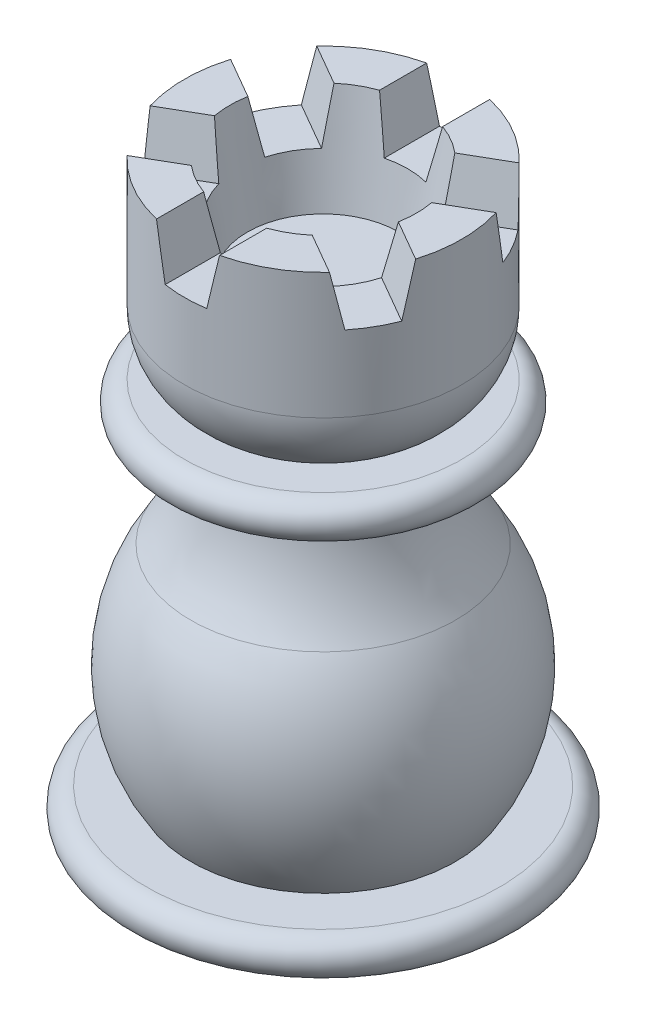
ISO-10303-21;
HEADER;
FILE_DESCRIPTION(('STEP AP214'),'2;1');
FILE_NAME('part.step','',(''),(''),'','','');
FILE_SCHEMA(('AUTOMOTIVE_DESIGN { 1 0 10303 214 1 1 1 1 }'));
ENDSEC;
DATA;
#1=APPLICATION_CONTEXT('core data for automotive mechanical design processes');
#2=APPLICATION_PROTOCOL_DEFINITION('international standard','automotive_design',2000,#1);
#3=PRODUCT_CONTEXT('',#1,'mechanical');
#4=PRODUCT('Part','Part','',(#3));
#5=PRODUCT_RELATED_PRODUCT_CATEGORY('part','',(#4));
#6=PRODUCT_DEFINITION_FORMATION('','',#4);
#7=PRODUCT_DEFINITION_CONTEXT('part definition',#1,'design');
#8=PRODUCT_DEFINITION('design','',#6,#7);
#9=PRODUCT_DEFINITION_SHAPE('','',#8);
#10=(LENGTH_UNIT() NAMED_UNIT(*) SI_UNIT(.MILLI.,.METRE.));
#11=(NAMED_UNIT(*) PLANE_ANGLE_UNIT() SI_UNIT($,.RADIAN.));
#12=(NAMED_UNIT(*) SI_UNIT($,.STERADIAN.) SOLID_ANGLE_UNIT());
#13=UNCERTAINTY_MEASURE_WITH_UNIT(LENGTH_MEASURE(1.E-05),#10,'distance_accuracy_value','');
#14=(GEOMETRIC_REPRESENTATION_CONTEXT(3) GLOBAL_UNCERTAINTY_ASSIGNED_CONTEXT((#13)) GLOBAL_UNIT_ASSIGNED_CONTEXT((#10,
#11,#12)) REPRESENTATION_CONTEXT('',''));
#15=CARTESIAN_POINT('',(0.,0.,0.));
#16=DIRECTION('',(0.,0.,1.));
#17=DIRECTION('',(1.,0.,0.));
#18=AXIS2_PLACEMENT_3D('',#15,#16,#17);
#19=CARTESIAN_POINT('',(0.,0.,0.));
#20=DIRECTION('',(0.,-1.,0.));
#21=DIRECTION('',(0.,0.,-1.));
#22=AXIS2_PLACEMENT_3D('',#19,#20,#21);
#23=CYLINDRICAL_SURFACE('',#22,11.);
#24=CARTESIAN_POINT('',(0.,36.,0.));
#25=DIRECTION('',(0.,-1.,0.));
#26=DIRECTION('',(0.,0.,-1.));
#27=AXIS2_PLACEMENT_3D('',#24,#25,#26);
#28=CIRCLE('',#27,11.);
#29=CARTESIAN_POINT('',(0.,36.,-11.));
#30=VERTEX_POINT('',#29);
#31=EDGE_CURVE('E314',#30,#30,#28,.T.);
#32=ORIENTED_EDGE('',*,*,#31,.F.);
#33=EDGE_LOOP('',(#32));
#34=FACE_BOUND('',#33,.T.);
#35=CARTESIAN_POINT('',(0.,46.,0.));
#36=DIRECTION('',(0.,-1.,0.));
#37=DIRECTION('',(0.,0.,-1.));
#38=AXIS2_PLACEMENT_3D('',#35,#36,#37);
#39=CIRCLE('',#38,11.);
#40=CARTESIAN_POINT('',(-2.50022624668006,46.,10.7120898388415));
#41=VERTEX_POINT('',#40);
#42=CARTESIAN_POINT('',(-8.02682880471799,46.,7.52130436425426));
#43=VERTEX_POINT('',#42);
#44=EDGE_CURVE('E316',#41,#43,#39,.T.);
#45=ORIENTED_EDGE('',*,*,#44,.T.);
#46=CARTESIAN_POINT('',(0.,34.2373603193603,0.));
#47=DIRECTION('',(-0.489073800366896,0.207911690817753,-0.84710067088628));
#48=DIRECTION('',(-0.103955845408875,-0.978147600733807,-0.180056805991951));
#49=AXIS2_PLACEMENT_3D('',#46,#47,#48);
#50=ELLIPSE('',#49,52.9070777921871,11.);
#51=CARTESIAN_POINT('',(-8.5934990842491,42.,6.86671489789768));
#52=VERTEX_POINT('',#51);
#53=EDGE_CURVE('E240',#43,#52,#50,.F.);
#54=ORIENTED_EDGE('',*,*,#53,.T.);
#55=CARTESIAN_POINT('',(0.,42.,0.));
#56=DIRECTION('',(0.,1.,0.));
#57=DIRECTION('',(0.,0.,1.));
#58=AXIS2_PLACEMENT_3D('',#55,#56,#57);
#59=CIRCLE('',#58,11.);
#60=CARTESIAN_POINT('',(-10.2433322824954,42.,4.00925725669821));
#61=VERTEX_POINT('',#60);
#62=EDGE_CURVE('E213',#52,#61,#59,.F.);
#63=ORIENTED_EDGE('',*,*,#62,.T.);
#64=CARTESIAN_POINT('',(0.,34.2394891332471,0.));
#65=DIRECTION('',(0.489073800366895,0.207911690817759,0.847100670886278));
#66=DIRECTION('',(0.103955845408878,-0.978147600733806,0.180056805991956));
#67=AXIS2_PLACEMENT_3D('',#64,#65,#66);
#68=ELLIPSE('',#67,52.9070777921854,11.);
#69=CARTESIAN_POINT('',(-10.5269202595179,46.,3.19123014678541));
#70=VERTEX_POINT('',#69);
#71=EDGE_CURVE('E223',#61,#70,#68,.F.);
#72=ORIENTED_EDGE('',*,*,#71,.T.);
#73=CARTESIAN_POINT('',(-10.5269202595178,46.,-3.19123014678555));
#74=VERTEX_POINT('',#73);
#75=EDGE_CURVE('E408',#70,#74,#39,.T.);
#76=ORIENTED_EDGE('',*,*,#75,.T.);
#77=CARTESIAN_POINT('',(0.,34.2394891332471,0.));
#78=DIRECTION('',(0.489073800366907,0.20791169081776,-0.847100670886272));
#79=DIRECTION('',(0.103955845408881,-0.978147600733806,-0.180056805991955));
#80=AXIS2_PLACEMENT_3D('',#77,#78,#79);
#81=ELLIPSE('',#80,52.9070777921854,11.);
#82=CARTESIAN_POINT('',(-10.2433322824954,42.,-4.00925725669836));
#83=VERTEX_POINT('',#82);
#84=EDGE_CURVE('E257',#74,#83,#81,.F.);
#85=ORIENTED_EDGE('',*,*,#84,.T.);
#86=CARTESIAN_POINT('',(0.,42.,0.));
#87=DIRECTION('',(0.,1.,0.));
#88=DIRECTION('',(0.,0.,1.));
#89=AXIS2_PLACEMENT_3D('',#86,#87,#88);
#90=CIRCLE('',#89,11.);
#91=CARTESIAN_POINT('',(-8.593499084249,42.,-6.86671489789779));
#92=VERTEX_POINT('',#91);
#93=EDGE_CURVE('E274',#83,#92,#90,.F.);
#94=ORIENTED_EDGE('',*,*,#93,.T.);
#95=CARTESIAN_POINT('',(0.,34.2373603193603,0.));
#96=DIRECTION('',(-0.489073800366908,0.207911690817753,0.847100670886273));
#97=DIRECTION('',(-0.103955845408877,-0.978147600733807,0.180056805991949));
#98=AXIS2_PLACEMENT_3D('',#95,#96,#97);
#99=ELLIPSE('',#98,52.9070777921871,11.);
#100=CARTESIAN_POINT('',(-8.02682880471786,46.,-7.52130436425436));
#101=VERTEX_POINT('',#100);
#102=EDGE_CURVE('E271',#92,#101,#99,.F.);
#103=ORIENTED_EDGE('',*,*,#102,.T.);
#104=CARTESIAN_POINT('',(-2.50022624668006,46.,-10.7120898388415));
#105=VERTEX_POINT('',#104);
#106=EDGE_CURVE('E309',#101,#105,#39,.T.);
#107=ORIENTED_EDGE('',*,*,#106,.T.);
#108=CARTESIAN_POINT('',(0.,34.2373603193603,0.));
#109=DIRECTION('',(0.978147600733807,0.207911690817753,0.));
#110=DIRECTION('',(0.207911690817753,-0.978147600733807,0.));
#111=AXIS2_PLACEMENT_3D('',#108,#109,#110);
#112=ELLIPSE('',#111,52.9070777921871,11.);
#113=CARTESIAN_POINT('',(-1.65,42.,-10.8755459633069));
#114=VERTEX_POINT('',#113);
#115=EDGE_CURVE('E296',#105,#114,#112,.F.);
#116=ORIENTED_EDGE('',*,*,#115,.T.);
#117=CARTESIAN_POINT('',(0.,42.,0.));
#118=DIRECTION('',(0.,1.,0.));
#119=DIRECTION('',(0.,0.,1.));
#120=AXIS2_PLACEMENT_3D('',#117,#118,#119);
#121=CIRCLE('',#120,11.);
#122=CARTESIAN_POINT('',(1.64954750663985,42.,-10.8756146043954));
#123=VERTEX_POINT('',#122);
#124=EDGE_CURVE('E299',#114,#123,#121,.F.);
#125=ORIENTED_EDGE('',*,*,#124,.T.);
#126=CARTESIAN_POINT('',(0.,34.2394891332471,0.));
#127=DIRECTION('',(-0.978147600733806,0.207911690817759,0.));
#128=DIRECTION('',(-0.207911690817759,-0.978147600733806,0.));
#129=AXIS2_PLACEMENT_3D('',#126,#127,#128);
#130=ELLIPSE('',#129,52.9070777921854,11.);
#131=CARTESIAN_POINT('',(2.49977375331994,46.,-10.7121954417483));
#132=VERTEX_POINT('',#131);
#133=EDGE_CURVE('E294',#123,#132,#130,.F.);
#134=ORIENTED_EDGE('',*,*,#133,.T.);
#135=CARTESIAN_POINT('',(8.02714650619797,46.,-7.5209652949627));
#136=VERTEX_POINT('',#135);
#137=EDGE_CURVE('E221',#132,#136,#39,.T.);
#138=ORIENTED_EDGE('',*,*,#137,.T.);
#139=CARTESIAN_POINT('',(8.59378477585561,42.,-6.86635734769701));
#140=VERTEX_POINT('',#139);
#141=EDGE_CURVE('E220',#136,#140,#68,.F.);
#142=ORIENTED_EDGE('',*,*,#141,.T.);
#143=CARTESIAN_POINT('',(10.2434990842491,42.,-4.008831065409));
#144=VERTEX_POINT('',#143);
#145=EDGE_CURVE('E201',#140,#144,#59,.F.);
#146=ORIENTED_EDGE('',*,*,#145,.T.);
#147=CARTESIAN_POINT('',(10.527055051398,46.,-3.19078547458711));
#148=VERTEX_POINT('',#147);
#149=EDGE_CURVE('E212',#144,#148,#50,.F.);
#150=ORIENTED_EDGE('',*,*,#149,.T.);
#151=CARTESIAN_POINT('',(10.5270550513979,46.,3.19078547458726));
#152=VERTEX_POINT('',#151);
#153=EDGE_CURVE('E312',#148,#152,#39,.T.);
#154=ORIENTED_EDGE('',*,*,#153,.T.);
#155=CARTESIAN_POINT('',(10.243499084249,42.,4.00883106540915));
#156=VERTEX_POINT('',#155);
#157=EDGE_CURVE('E268',#152,#156,#99,.F.);
#158=ORIENTED_EDGE('',*,*,#157,.T.);
#159=CARTESIAN_POINT('',(8.5937847758555,42.,6.86635734769712));
#160=VERTEX_POINT('',#159);
#161=EDGE_CURVE('E275',#156,#160,#90,.F.);
#162=ORIENTED_EDGE('',*,*,#161,.T.);
#163=CARTESIAN_POINT('',(8.02714650619787,46.,7.52096529496282));
#164=VERTEX_POINT('',#163);
#165=EDGE_CURVE('E263',#160,#164,#81,.F.);
#166=ORIENTED_EDGE('',*,*,#165,.T.);
#167=CARTESIAN_POINT('',(2.49977375331994,46.,10.7121954417483));
#168=VERTEX_POINT('',#167);
#169=EDGE_CURVE('E415',#164,#168,#39,.T.);
#170=ORIENTED_EDGE('',*,*,#169,.T.);
#171=CARTESIAN_POINT('',(1.64954750663985,42.,10.8756146043954));
#172=VERTEX_POINT('',#171);
#173=EDGE_CURVE('E292',#168,#172,#130,.F.);
#174=ORIENTED_EDGE('',*,*,#173,.T.);
#175=CARTESIAN_POINT('',(-1.65,42.,10.8755459633069));
#176=VERTEX_POINT('',#175);
#177=EDGE_CURVE('E293',#172,#176,#121,.F.);
#178=ORIENTED_EDGE('',*,*,#177,.T.);
#179=EDGE_CURVE('E305',#176,#41,#112,.F.);
#180=ORIENTED_EDGE('',*,*,#179,.T.);
#181=EDGE_LOOP('',(#45,#54,#63,#72,#76,#85,#94,#103,#107,#116,#125,#134,#138,#142,#146,#150,
#154,#158,#162,#166,#170,#174,#178,#180));
#182=FACE_BOUND('',#181,.T.);
#183=ADVANCED_FACE('F41',(#34,#182),#23,.T.);
#184=CARTESIAN_POINT('',(0.,46.,0.));
#185=DIRECTION('',(0.,1.,0.));
#186=DIRECTION('',(0.,0.,1.));
#187=AXIS2_PLACEMENT_3D('',#184,#185,#186);
#188=CONICAL_SURFACE('',#187,7.41061584566766,0.174532925199426);
#189=CARTESIAN_POINT('',(0.,38.,0.));
#190=DIRECTION('',(0.,-1.,0.));
#191=DIRECTION('',(0.,0.,-1.));
#192=AXIS2_PLACEMENT_3D('',#189,#190,#191);
#193=CIRCLE('',#192,6.);
#194=CARTESIAN_POINT('',(0.,38.,-6.));
#195=VERTEX_POINT('',#194);
#196=EDGE_CURVE('E303',#195,#195,#193,.T.);
#197=ORIENTED_EDGE('',*,*,#196,.T.);
#198=EDGE_LOOP('',(#197));
#199=FACE_BOUND('',#198,.T.);
#200=CARTESIAN_POINT('',(0.,42.,0.));
#201=DIRECTION('',(0.,1.,0.));
#202=DIRECTION('',(0.,0.,1.));
#203=AXIS2_PLACEMENT_3D('',#200,#201,#202);
#204=CIRCLE('',#203,6.70530792283383);
#205=CARTESIAN_POINT('',(-6.45328248321612,42.,1.82107098484227));
#206=VERTEX_POINT('',#205);
#207=CARTESIAN_POINT('',(-4.80340925617657,42.,4.67850551540718));
#208=VERTEX_POINT('',#207);
#209=EDGE_CURVE('E11',#206,#208,#204,.T.);
#210=ORIENTED_EDGE('',*,*,#209,.T.);
#211=CARTESIAN_POINT('',(7.09807528183645,101.024997699909,12.2942270240898));
#212=DIRECTION('',(-0.489073800366896,0.207911690817753,-0.84710067088628));
#213=DIRECTION('',(0.103955845408875,0.978147600733807,0.180056805991951));
#214=AXIS2_PLACEMENT_3D('',#211,#212,#213);
#215=ELLIPSE('',#214,82.3090201723333,9.55637675599336);
#216=CARTESIAN_POINT('',(-4.79137443731963,46.,5.65331391428611));
#217=VERTEX_POINT('',#216);
#218=EDGE_CURVE('E226',#208,#217,#215,.T.);
#219=ORIENTED_EDGE('',*,*,#218,.T.);
#220=CARTESIAN_POINT('',(0.,46.,0.));
#221=DIRECTION('',(0.,-1.,0.));
#222=DIRECTION('',(0.,0.,-1.));
#223=AXIS2_PLACEMENT_3D('',#220,#221,#222);
#224=CIRCLE('',#223,7.41061584566766);
#225=CARTESIAN_POINT('',(-2.50022624668006,46.,6.9761089389052));
#226=VERTEX_POINT('',#225);
#227=EDGE_CURVE('E315',#226,#217,#224,.T.);
#228=ORIENTED_EDGE('',*,*,#227,.F.);
#229=CARTESIAN_POINT('',(-14.1961505636732,101.024997699909,0.));
#230=DIRECTION('',(0.978147600733807,0.207911690817753,0.));
#231=DIRECTION('',(-0.207911690817753,0.978147600733807,0.));
#232=AXIS2_PLACEMENT_3D('',#229,#230,#231);
#233=ELLIPSE('',#232,82.309020172334,9.5563767559934);
#234=CARTESIAN_POINT('',(-1.65,42.,6.4991271983258));
#235=VERTEX_POINT('',#234);
#236=EDGE_CURVE('E348',#226,#235,#233,.T.);
#237=ORIENTED_EDGE('',*,*,#236,.T.);
#238=CARTESIAN_POINT('',(0.,42.,0.));
#239=DIRECTION('',(0.,1.,0.));
#240=DIRECTION('',(0.,0.,1.));
#241=AXIS2_PLACEMENT_3D('',#238,#239,#240);
#242=CIRCLE('',#241,6.70530792283383);
#243=CARTESIAN_POINT('',(1.64954750663985,42.,6.49924206068339));
#244=VERTEX_POINT('',#243);
#245=EDGE_CURVE('E347',#235,#244,#242,.T.);
#246=ORIENTED_EDGE('',*,*,#245,.T.);
#247=CARTESIAN_POINT('',(14.1971491069152,101.031824290395,0.));
#248=DIRECTION('',(-0.978147600733806,0.207911690817759,0.));
#249=DIRECTION('',(0.207911690817759,0.978147600733805,0.));
#250=AXIS2_PLACEMENT_3D('',#247,#248,#249);
#251=ELLIPSE('',#250,82.3148097077069,9.55704894211873);
#252=CARTESIAN_POINT('',(2.49977375331994,46.,6.97627109523945));
#253=VERTEX_POINT('',#252);
#254=EDGE_CURVE('E343',#244,#253,#251,.T.);
#255=ORIENTED_EDGE('',*,*,#254,.T.);
#256=CARTESIAN_POINT('',(4.79174111550447,46.,5.6530031217084));
#257=VERTEX_POINT('',#256);
#258=EDGE_CURVE('E422',#257,#253,#224,.T.);
#259=ORIENTED_EDGE('',*,*,#258,.F.);
#260=CARTESIAN_POINT('',(-7.09857455345775,101.031824290396,12.2950917879042));
#261=DIRECTION('',(0.489073800366907,0.20791169081776,-0.847100670886272));
#262=DIRECTION('',(-0.103955845408881,0.978147600733806,0.180056805991955));
#263=AXIS2_PLACEMENT_3D('',#260,#261,#262);
#264=ELLIPSE('',#263,82.3148097077083,9.55704894211881);
#265=CARTESIAN_POINT('',(4.80373497657627,42.,4.67817107584114));
#266=VERTEX_POINT('',#265);
#267=EDGE_CURVE('E259',#257,#266,#264,.T.);
#268=ORIENTED_EDGE('',*,*,#267,.T.);
#269=CARTESIAN_POINT('',(0.,42.,0.));
#270=DIRECTION('',(0.,1.,0.));
#271=DIRECTION('',(0.,0.,1.));
#272=AXIS2_PLACEMENT_3D('',#269,#270,#271);
#273=CIRCLE('',#272,6.70530792283383);
#274=CARTESIAN_POINT('',(6.45340925617652,42.,1.8206216829186));
#275=VERTEX_POINT('',#274);
#276=EDGE_CURVE('E356',#266,#275,#273,.T.);
#277=ORIENTED_EDGE('',*,*,#276,.T.);
#278=CARTESIAN_POINT('',(7.09807528183677,101.02499769991,-12.2942270240899));
#279=DIRECTION('',(-0.489073800366908,0.207911690817753,0.847100670886273));
#280=DIRECTION('',(0.103955845408877,0.978147600733807,-0.180056805991949));
#281=AXIS2_PLACEMENT_3D('',#278,#279,#280);
#282=ELLIPSE('',#281,82.3090201723354,9.55637675599349);
#283=CARTESIAN_POINT('',(7.29160068399963,46.,1.32279502461907));
#284=VERTEX_POINT('',#283);
#285=EDGE_CURVE('E262',#275,#284,#282,.T.);
#286=ORIENTED_EDGE('',*,*,#285,.T.);
#287=CARTESIAN_POINT('',(7.29160068399962,46.,-1.32279502461895));
#288=VERTEX_POINT('',#287);
#289=EDGE_CURVE('E313',#288,#284,#224,.T.);
#290=ORIENTED_EDGE('',*,*,#289,.F.);
#291=CARTESIAN_POINT('',(6.45340925617655,42.,-1.82062168291851));
#292=VERTEX_POINT('',#291);
#293=EDGE_CURVE('E237',#288,#292,#215,.T.);
#294=ORIENTED_EDGE('',*,*,#293,.T.);
#295=CARTESIAN_POINT('',(4.80373497657623,42.,-4.67817107584102));
#296=VERTEX_POINT('',#295);
#297=EDGE_CURVE('E44',#292,#296,#204,.T.);
#298=ORIENTED_EDGE('',*,*,#297,.T.);
#299=CARTESIAN_POINT('',(-7.09857455345743,101.031824290395,-12.2950917879041));
#300=DIRECTION('',(0.489073800366895,0.207911690817759,0.847100670886278));
#301=DIRECTION('',(-0.103955845408878,0.978147600733805,-0.180056805991956));
#302=AXIS2_PLACEMENT_3D('',#299,#300,#301);
#303=ELLIPSE('',#302,82.3148097077063,9.5570489421187);
#304=CARTESIAN_POINT('',(4.79174111550454,46.,-5.65300312170831));
#305=VERTEX_POINT('',#304);
#306=EDGE_CURVE('E217',#296,#305,#303,.T.);
#307=ORIENTED_EDGE('',*,*,#306,.T.);
#308=CARTESIAN_POINT('',(2.49977375331994,46.,-6.97627109523949));
#309=VERTEX_POINT('',#308);
#310=EDGE_CURVE('E307',#309,#305,#224,.T.);
#311=ORIENTED_EDGE('',*,*,#310,.F.);
#312=CARTESIAN_POINT('',(1.64954750663985,42.,-6.49924206068345));
#313=VERTEX_POINT('',#312);
#314=EDGE_CURVE('E350',#309,#313,#251,.T.);
#315=ORIENTED_EDGE('',*,*,#314,.T.);
#316=CARTESIAN_POINT('',(-1.65,42.,-6.4991271983258));
#317=VERTEX_POINT('',#316);
#318=EDGE_CURVE('E352',#313,#317,#242,.T.);
#319=ORIENTED_EDGE('',*,*,#318,.T.);
#320=CARTESIAN_POINT('',(-2.50022624668006,46.,-6.9761089389052));
#321=VERTEX_POINT('',#320);
#322=EDGE_CURVE('E354',#317,#321,#233,.T.);
#323=ORIENTED_EDGE('',*,*,#322,.T.);
#324=CARTESIAN_POINT('',(-4.79137443731961,46.,-5.65331391428622));
#325=VERTEX_POINT('',#324);
#326=EDGE_CURVE('E308',#325,#321,#224,.T.);
#327=ORIENTED_EDGE('',*,*,#326,.F.);
#328=CARTESIAN_POINT('',(-4.8034092561765,42.,-4.67850551540725));
#329=VERTEX_POINT('',#328);
#330=EDGE_CURVE('E270',#325,#329,#282,.T.);
#331=ORIENTED_EDGE('',*,*,#330,.T.);
#332=CARTESIAN_POINT('',(-6.45328248321615,42.,-1.8210709848424));
#333=VERTEX_POINT('',#332);
#334=EDGE_CURVE('E351',#329,#333,#273,.T.);
#335=ORIENTED_EDGE('',*,*,#334,.T.);
#336=CARTESIAN_POINT('',(-7.29151486882445,46.,-1.32326797353113));
#337=VERTEX_POINT('',#336);
#338=EDGE_CURVE('E254',#333,#337,#264,.T.);
#339=ORIENTED_EDGE('',*,*,#338,.T.);
#340=CARTESIAN_POINT('',(-7.29151486882446,46.,1.32326797353104));
#341=VERTEX_POINT('',#340);
#342=EDGE_CURVE('E403',#341,#337,#224,.T.);
#343=ORIENTED_EDGE('',*,*,#342,.F.);
#344=EDGE_CURVE('E227',#341,#206,#303,.T.);
#345=ORIENTED_EDGE('',*,*,#344,.T.);
#346=EDGE_LOOP('',(#210,#219,#228,#237,#246,#255,#259,#268,#277,#286,#290,#294,#298,#307,#311,
#315,#319,#323,#327,#331,#335,#339,#343,#345));
#347=FACE_BOUND('',#346,.T.);
#348=ADVANCED_FACE('F372',(#199,#347),#188,.F.);
#349=CARTESIAN_POINT('',(11.,46.,0.));
#350=DIRECTION('',(0.,1.,0.));
#351=DIRECTION('',(0.,0.,1.));
#352=AXIS2_PLACEMENT_3D('',#349,#350,#351);
#353=PLANE('',#352);
#354=ORIENTED_EDGE('',*,*,#153,.F.);
#355=DIRECTION('',(-0.866025403784443,0.,0.499999999999992));
#356=VECTOR('',#355,1.);
#357=CARTESIAN_POINT('',(81.947723654792,46.,-44.4255277184588));
#358=LINE('',#357,#356);
#359=EDGE_CURVE('E390',#148,#288,#358,.T.);
#360=ORIENTED_EDGE('',*,*,#359,.T.);
#361=ORIENTED_EDGE('',*,*,#289,.T.);
#362=DIRECTION('',(0.866025403784436,0.,0.500000000000004));
#363=VECTOR('',#362,1.);
#364=CARTESIAN_POINT('',(-79.4474974081113,46.,-48.7560466081271));
#365=LINE('',#364,#363);
#366=EDGE_CURVE('E258',#284,#152,#365,.T.);
#367=ORIENTED_EDGE('',*,*,#366,.T.);
#368=EDGE_LOOP('',(#354,#360,#361,#367));
#369=FACE_BOUND('',#368,.T.);
#370=ADVANCED_FACE('F467',(#369),#353,.T.);
#371=ORIENTED_EDGE('',*,*,#227,.T.);
#372=EDGE_CURVE('E383',#217,#43,#358,.T.);
#373=ORIENTED_EDGE('',*,*,#372,.T.);
#374=ORIENTED_EDGE('',*,*,#44,.F.);
#375=DIRECTION('',(0.,0.,-1.));
#376=VECTOR('',#375,1.);
#377=CARTESIAN_POINT('',(-2.50022624668006,46.,96.9315743265863));
#378=LINE('',#377,#376);
#379=EDGE_CURVE('E289',#41,#226,#378,.T.);
#380=ORIENTED_EDGE('',*,*,#379,.T.);
#381=EDGE_LOOP('',(#371,#373,#374,#380));
#382=FACE_BOUND('',#381,.T.);
#383=ADVANCED_FACE('F528',(#382),#353,.T.);
#384=ORIENTED_EDGE('',*,*,#106,.F.);
#385=EDGE_CURVE('E252',#101,#325,#365,.T.);
#386=ORIENTED_EDGE('',*,*,#385,.T.);
#387=ORIENTED_EDGE('',*,*,#326,.T.);
#388=EDGE_CURVE('E290',#321,#105,#378,.T.);
#389=ORIENTED_EDGE('',*,*,#388,.T.);
#390=EDGE_LOOP('',(#384,#386,#387,#389));
#391=FACE_BOUND('',#390,.T.);
#392=ADVANCED_FACE('F429',(#391),#353,.T.);
#393=DIRECTION('',(-0.866025403784443,0.,0.499999999999992));
#394=VECTOR('',#393,1.);
#395=CARTESIAN_POINT('',(79.447723654792,46.,-48.755654737381));
#396=LINE('',#395,#394);
#397=EDGE_CURVE('E61',#136,#305,#396,.T.);
#398=ORIENTED_EDGE('',*,*,#397,.F.);
#399=ORIENTED_EDGE('',*,*,#137,.F.);
#400=DIRECTION('',(0.,0.,-1.));
#401=VECTOR('',#400,1.);
#402=CARTESIAN_POINT('',(2.49977375331994,46.,96.9315743265863));
#403=LINE('',#402,#401);
#404=EDGE_CURVE('E277',#309,#132,#403,.T.);
#405=ORIENTED_EDGE('',*,*,#404,.F.);
#406=ORIENTED_EDGE('',*,*,#310,.T.);
#407=EDGE_LOOP('',(#398,#399,#405,#406));
#408=FACE_BOUND('',#407,.T.);
#409=ADVANCED_FACE('F377',(#408),#353,.T.);
#410=EDGE_CURVE('E359',#341,#70,#396,.T.);
#411=ORIENTED_EDGE('',*,*,#410,.F.);
#412=ORIENTED_EDGE('',*,*,#342,.T.);
#413=DIRECTION('',(0.866025403784436,0.,0.500000000000004));
#414=VECTOR('',#413,1.);
#415=CARTESIAN_POINT('',(-81.9474974081113,46.,-44.4259195892049));
#416=LINE('',#415,#414);
#417=EDGE_CURVE('E238',#74,#337,#416,.T.);
#418=ORIENTED_EDGE('',*,*,#417,.F.);
#419=ORIENTED_EDGE('',*,*,#75,.F.);
#420=EDGE_LOOP('',(#411,#412,#418,#419));
#421=FACE_BOUND('',#420,.T.);
#422=ADVANCED_FACE('F409',(#421),#353,.T.);
#423=CARTESIAN_POINT('',(0.,0.,0.));
#424=DIRECTION('',(0.,-1.,0.));
#425=DIRECTION('',(0.,0.,-1.));
#426=AXIS2_PLACEMENT_3D('',#423,#424,#425);
#427=PLANE('',#426);
#428=CARTESIAN_POINT('',(0.,0.,0.));
#429=DIRECTION('',(0.,-1.,0.));
#430=DIRECTION('',(0.,0.,-1.));
#431=AXIS2_PLACEMENT_3D('',#428,#429,#430);
#432=CIRCLE('',#431,14.);
#433=CARTESIAN_POINT('',(0.,0.,-14.));
#434=VERTEX_POINT('',#433);
#435=EDGE_CURVE('E338',#434,#434,#432,.T.);
#436=ORIENTED_EDGE('',*,*,#435,.T.);
#437=EDGE_LOOP('',(#436));
#438=FACE_BOUND('',#437,.T.);
#439=ADVANCED_FACE('F43',(#438),#427,.T.);
#440=CARTESIAN_POINT('',(0.,1.5,0.));
#441=DIRECTION('',(0.,-1.,0.));
#442=DIRECTION('',(0.,0.,-1.));
#443=AXIS2_PLACEMENT_3D('',#440,#441,#442);
#444=TOROIDAL_SURFACE('',#443,14.,1.5);
#445=CARTESIAN_POINT('',(0.,3.,0.));
#446=DIRECTION('',(0.,-1.,0.));
#447=DIRECTION('',(0.,0.,-1.));
#448=AXIS2_PLACEMENT_3D('',#445,#446,#447);
#449=CIRCLE('',#448,14.);
#450=CARTESIAN_POINT('',(0.,3.,-14.));
#451=VERTEX_POINT('',#450);
#452=EDGE_CURVE('E340',#451,#451,#449,.T.);
#453=ORIENTED_EDGE('',*,*,#452,.T.);
#454=EDGE_LOOP('',(#453));
#455=FACE_BOUND('',#454,.T.);
#456=ORIENTED_EDGE('',*,*,#435,.F.);
#457=EDGE_LOOP('',(#456));
#458=FACE_BOUND('',#457,.T.);
#459=ADVANCED_FACE('F502',(#455,#458),#444,.T.);
#460=CARTESIAN_POINT('',(14.,3.,0.));
#461=DIRECTION('',(0.,1.,0.));
#462=DIRECTION('',(0.,0.,1.));
#463=AXIS2_PLACEMENT_3D('',#460,#461,#462);
#464=PLANE('',#463);
#465=CARTESIAN_POINT('',(0.,3.,0.));
#466=DIRECTION('',(0.,-1.,0.));
#467=DIRECTION('',(0.,0.,-1.));
#468=AXIS2_PLACEMENT_3D('',#465,#466,#467);
#469=CIRCLE('',#468,10.5);
#470=CARTESIAN_POINT('',(0.,3.,-10.5));
#471=VERTEX_POINT('',#470);
#472=EDGE_CURVE('E331',#471,#471,#469,.T.);
#473=ORIENTED_EDGE('',*,*,#472,.T.);
#474=EDGE_LOOP('',(#473));
#475=FACE_BOUND('',#474,.T.);
#476=ORIENTED_EDGE('',*,*,#452,.F.);
#477=EDGE_LOOP('',(#476));
#478=FACE_BOUND('',#477,.T.);
#479=ADVANCED_FACE('F499',(#475,#478),#464,.T.);
#480=CARTESIAN_POINT('',(0.,11.2915619758885,0.));
#481=DIRECTION('',(0.,-1.,0.));
#482=DIRECTION('',(0.,0.,-1.));
#483=AXIS2_PLACEMENT_3D('',#480,#481,#482);
#484=DEGENERATE_TOROIDAL_SURFACE('',#483,2.,15.,.F.);
#485=CARTESIAN_POINT('',(0.,19.583123951777,0.));
#486=DIRECTION('',(0.,-1.,0.));
#487=DIRECTION('',(0.,0.,-1.));
#488=AXIS2_PLACEMENT_3D('',#485,#486,#487);
#489=CIRCLE('',#488,10.5);
#490=CARTESIAN_POINT('',(0.,19.583123951777,-10.5));
#491=VERTEX_POINT('',#490);
#492=EDGE_CURVE('E332',#491,#491,#489,.T.);
#493=ORIENTED_EDGE('',*,*,#492,.T.);
#494=EDGE_LOOP('',(#493));
#495=FACE_BOUND('',#494,.T.);
#496=ORIENTED_EDGE('',*,*,#472,.F.);
#497=EDGE_LOOP('',(#496));
#498=FACE_BOUND('',#497,.T.);
#499=ADVANCED_FACE('F493',(#495,#498),#484,.F.);
#500=CARTESIAN_POINT('',(0.,27.8746859276655,0.));
#501=DIRECTION('',(0.,-1.,0.));
#502=DIRECTION('',(0.,0.,-1.));
#503=AXIS2_PLACEMENT_3D('',#500,#501,#502);
#504=TOROIDAL_SURFACE('',#503,23.,15.);
#505=CARTESIAN_POINT('',(0.,27.8746859276655,0.));
#506=DIRECTION('',(0.,-1.,0.));
#507=DIRECTION('',(0.,0.,-1.));
#508=AXIS2_PLACEMENT_3D('',#505,#506,#507);
#509=CIRCLE('',#508,8.);
#510=CARTESIAN_POINT('',(0.,27.8746859276655,-8.));
#511=VERTEX_POINT('',#510);
#512=EDGE_CURVE('E327',#511,#511,#509,.T.);
#513=ORIENTED_EDGE('',*,*,#512,.T.);
#514=EDGE_LOOP('',(#513));
#515=FACE_BOUND('',#514,.T.);
#516=ORIENTED_EDGE('',*,*,#492,.F.);
#517=EDGE_LOOP('',(#516));
#518=FACE_BOUND('',#517,.T.);
#519=ADVANCED_FACE('F489',(#515,#518),#504,.F.);
#520=CARTESIAN_POINT('',(8.,27.8746859276655,0.));
#521=DIRECTION('',(0.,-1.,0.));
#522=DIRECTION('',(0.,0.,-1.));
#523=AXIS2_PLACEMENT_3D('',#520,#521,#522);
#524=PLANE('',#523);
#525=CARTESIAN_POINT('',(0.,27.8746859276655,0.));
#526=DIRECTION('',(0.,-1.,0.));
#527=DIRECTION('',(0.,0.,-1.));
#528=AXIS2_PLACEMENT_3D('',#525,#526,#527);
#529=CIRCLE('',#528,11.);
#530=CARTESIAN_POINT('',(0.,27.8746859276655,-11.));
#531=VERTEX_POINT('',#530);
#532=EDGE_CURVE('E324',#531,#531,#529,.T.);
#533=ORIENTED_EDGE('',*,*,#532,.T.);
#534=EDGE_LOOP('',(#533));
#535=FACE_BOUND('',#534,.T.);
#536=ORIENTED_EDGE('',*,*,#512,.F.);
#537=EDGE_LOOP('',(#536));
#538=FACE_BOUND('',#537,.T.);
#539=ADVANCED_FACE('F486',(#535,#538),#524,.T.);
#540=CARTESIAN_POINT('',(0.,29.3746859276655,0.));
#541=DIRECTION('',(0.,-1.,0.));
#542=DIRECTION('',(0.,0.,-1.));
#543=AXIS2_PLACEMENT_3D('',#540,#541,#542);
#544=TOROIDAL_SURFACE('',#543,11.,1.5);
#545=CARTESIAN_POINT('',(0.,30.8746859276655,0.));
#546=DIRECTION('',(0.,-1.,0.));
#547=DIRECTION('',(0.,0.,-1.));
#548=AXIS2_PLACEMENT_3D('',#545,#546,#547);
#549=CIRCLE('',#548,11.);
#550=CARTESIAN_POINT('',(0.,30.8746859276655,-11.));
#551=VERTEX_POINT('',#550);
#552=EDGE_CURVE('E325',#551,#551,#549,.T.);
#553=ORIENTED_EDGE('',*,*,#552,.T.);
#554=EDGE_LOOP('',(#553));
#555=FACE_BOUND('',#554,.T.);
#556=ORIENTED_EDGE('',*,*,#532,.F.);
#557=EDGE_LOOP('',(#556));
#558=FACE_BOUND('',#557,.T.);
#559=ADVANCED_FACE('F485',(#555,#558),#544,.T.);
#560=CARTESIAN_POINT('',(11.,30.8746859276655,0.));
#561=DIRECTION('',(0.,1.,0.));
#562=DIRECTION('',(0.,0.,1.));
#563=AXIS2_PLACEMENT_3D('',#560,#561,#562);
#564=PLANE('',#563);
#565=CARTESIAN_POINT('',(0.,30.8746859276655,0.));
#566=DIRECTION('',(0.,-1.,0.));
#567=DIRECTION('',(0.,0.,-1.));
#568=AXIS2_PLACEMENT_3D('',#565,#566,#567);
#569=CIRCLE('',#568,8.11948003037844);
#570=CARTESIAN_POINT('',(0.,30.8746859276655,-8.11948003037844));
#571=VERTEX_POINT('',#570);
#572=EDGE_CURVE('E317',#571,#571,#569,.T.);
#573=ORIENTED_EDGE('',*,*,#572,.T.);
#574=EDGE_LOOP('',(#573));
#575=FACE_BOUND('',#574,.T.);
#576=ORIENTED_EDGE('',*,*,#552,.F.);
#577=EDGE_LOOP('',(#576));
#578=FACE_BOUND('',#577,.T.);
#579=ADVANCED_FACE('F476',(#575,#578),#564,.T.);
#580=CARTESIAN_POINT('',(0.,36.,0.));
#581=DIRECTION('',(0.,-1.,0.));
#582=DIRECTION('',(0.,0.,-1.));
#583=AXIS2_PLACEMENT_3D('',#580,#581,#582);
#584=DEGENERATE_TOROIDAL_SURFACE('',#583,5.,6.,.T.);
#585=ORIENTED_EDGE('',*,*,#31,.T.);
#586=EDGE_LOOP('',(#585));
#587=FACE_BOUND('',#586,.T.);
#588=ORIENTED_EDGE('',*,*,#572,.F.);
#589=EDGE_LOOP('',(#588));
#590=FACE_BOUND('',#589,.T.);
#591=ADVANCED_FACE('F474',(#587,#590),#584,.T.);
#592=EDGE_CURVE('E243',#257,#164,#416,.T.);
#593=ORIENTED_EDGE('',*,*,#592,.F.);
#594=ORIENTED_EDGE('',*,*,#258,.T.);
#595=EDGE_CURVE('E279',#168,#253,#403,.T.);
#596=ORIENTED_EDGE('',*,*,#595,.F.);
#597=ORIENTED_EDGE('',*,*,#169,.F.);
#598=EDGE_LOOP('',(#593,#594,#596,#597));
#599=FACE_BOUND('',#598,.T.);
#600=ADVANCED_FACE('F421',(#599),#353,.T.);
#601=CARTESIAN_POINT('',(6.,38.,0.));
#602=DIRECTION('',(0.,1.,0.));
#603=DIRECTION('',(0.,0.,1.));
#604=AXIS2_PLACEMENT_3D('',#601,#602,#603);
#605=PLANE('',#604);
#606=ORIENTED_EDGE('',*,*,#196,.F.);
#607=EDGE_LOOP('',(#606));
#608=FACE_BOUND('',#607,.T.);
#609=ADVANCED_FACE('F516',(#608),#605,.T.);
#610=CARTESIAN_POINT('',(1.64954750663985,42.,96.9315743265863));
#611=DIRECTION('',(-0.978147600733806,0.207911690817759,0.));
#612=DIRECTION('',(-0.207911690817759,-0.978147600733806,0.));
#613=AXIS2_PLACEMENT_3D('',#610,#611,#612);
#614=PLANE('',#613);
#615=ORIENTED_EDGE('',*,*,#173,.F.);
#616=ORIENTED_EDGE('',*,*,#595,.T.);
#617=ORIENTED_EDGE('',*,*,#254,.F.);
#618=DIRECTION('',(0.,0.,-1.));
#619=VECTOR('',#618,1.);
#620=CARTESIAN_POINT('',(1.64954750663985,42.,96.9315743265863));
#621=LINE('',#620,#619);
#622=EDGE_CURVE('E276',#172,#244,#621,.T.);
#623=ORIENTED_EDGE('',*,*,#622,.F.);
#624=EDGE_LOOP('',(#615,#616,#617,#623));
#625=FACE_BOUND('',#624,.T.);
#626=ADVANCED_FACE('F423',(#625),#614,.T.);
#627=CARTESIAN_POINT('',(-1.65,42.,96.9315743265863));
#628=DIRECTION('',(0.,1.,0.));
#629=DIRECTION('',(0.,0.,1.));
#630=AXIS2_PLACEMENT_3D('',#627,#628,#629);
#631=PLANE('',#630);
#632=ORIENTED_EDGE('',*,*,#177,.F.);
#633=ORIENTED_EDGE('',*,*,#622,.T.);
#634=ORIENTED_EDGE('',*,*,#245,.F.);
#635=DIRECTION('',(0.,0.,-1.));
#636=VECTOR('',#635,1.);
#637=CARTESIAN_POINT('',(-1.65,42.,96.9315743265863));
#638=LINE('',#637,#636);
#639=EDGE_CURVE('E286',#176,#235,#638,.T.);
#640=ORIENTED_EDGE('',*,*,#639,.F.);
#641=EDGE_LOOP('',(#632,#633,#634,#640));
#642=FACE_BOUND('',#641,.T.);
#643=ADVANCED_FACE('F538',(#642),#631,.T.);
#644=CARTESIAN_POINT('',(-2.50022624668006,46.,96.9315743265863));
#645=DIRECTION('',(0.978147600733807,0.207911690817753,0.));
#646=DIRECTION('',(-0.207911690817753,0.978147600733807,0.));
#647=AXIS2_PLACEMENT_3D('',#644,#645,#646);
#648=PLANE('',#647);
#649=ORIENTED_EDGE('',*,*,#179,.F.);
#650=ORIENTED_EDGE('',*,*,#639,.T.);
#651=ORIENTED_EDGE('',*,*,#236,.F.);
#652=ORIENTED_EDGE('',*,*,#379,.F.);
#653=EDGE_LOOP('',(#649,#650,#651,#652));
#654=FACE_BOUND('',#653,.T.);
#655=ADVANCED_FACE('F459',(#654),#648,.T.);
#656=ORIENTED_EDGE('',*,*,#124,.F.);
#657=EDGE_CURVE('E284',#317,#114,#638,.T.);
#658=ORIENTED_EDGE('',*,*,#657,.F.);
#659=ORIENTED_EDGE('',*,*,#318,.F.);
#660=EDGE_CURVE('E278',#313,#123,#621,.T.);
#661=ORIENTED_EDGE('',*,*,#660,.T.);
#662=EDGE_LOOP('',(#656,#658,#659,#661));
#663=FACE_BOUND('',#662,.T.);
#664=ADVANCED_FACE('F541',(#663),#631,.T.);
#665=ORIENTED_EDGE('',*,*,#133,.F.);
#666=ORIENTED_EDGE('',*,*,#660,.F.);
#667=ORIENTED_EDGE('',*,*,#314,.F.);
#668=ORIENTED_EDGE('',*,*,#404,.T.);
#669=EDGE_LOOP('',(#665,#666,#667,#668));
#670=FACE_BOUND('',#669,.T.);
#671=ADVANCED_FACE('F380',(#670),#614,.T.);
#672=ORIENTED_EDGE('',*,*,#115,.F.);
#673=ORIENTED_EDGE('',*,*,#388,.F.);
#674=ORIENTED_EDGE('',*,*,#322,.F.);
#675=ORIENTED_EDGE('',*,*,#657,.T.);
#676=EDGE_LOOP('',(#672,#673,#674,#675));
#677=FACE_BOUND('',#676,.T.);
#678=ADVANCED_FACE('F433',(#677),#648,.T.);
#679=CARTESIAN_POINT('',(-81.5223842847713,42.,-45.1622371177941));
#680=DIRECTION('',(0.489073800366907,0.20791169081776,-0.847100670886272));
#681=DIRECTION('',(-0.866025403784436,0.,-0.500000000000004));
#682=AXIS2_PLACEMENT_3D('',#679,#680,#681);
#683=PLANE('',#682);
#684=ORIENTED_EDGE('',*,*,#84,.F.);
#685=ORIENTED_EDGE('',*,*,#417,.T.);
#686=ORIENTED_EDGE('',*,*,#338,.F.);
#687=DIRECTION('',(0.866025403784436,0.,0.500000000000004));
#688=VECTOR('',#687,1.);
#689=CARTESIAN_POINT('',(-81.5223842847713,42.,-45.1622371177941));
#690=LINE('',#689,#688);
#691=EDGE_CURVE('E241',#83,#333,#690,.T.);
#692=ORIENTED_EDGE('',*,*,#691,.F.);
#693=EDGE_LOOP('',(#684,#685,#686,#692));
#694=FACE_BOUND('',#693,.T.);
#695=ADVANCED_FACE('F450',(#694),#683,.T.);
#696=CARTESIAN_POINT('',(-79.8726105314513,42.,-48.0197290795378));
#697=DIRECTION('',(0.,1.,0.));
#698=DIRECTION('',(0.,0.,1.));
#699=AXIS2_PLACEMENT_3D('',#696,#697,#698);
#700=PLANE('',#699);
#701=ORIENTED_EDGE('',*,*,#93,.F.);
#702=ORIENTED_EDGE('',*,*,#691,.T.);
#703=ORIENTED_EDGE('',*,*,#334,.F.);
#704=DIRECTION('',(0.866025403784436,0.,0.500000000000004));
#705=VECTOR('',#704,1.);
#706=CARTESIAN_POINT('',(-79.8726105314513,42.,-48.0197290795378));
#707=LINE('',#706,#705);
#708=EDGE_CURVE('E253',#92,#329,#707,.T.);
#709=ORIENTED_EDGE('',*,*,#708,.F.);
#710=EDGE_LOOP('',(#701,#702,#703,#709));
#711=FACE_BOUND('',#710,.T.);
#712=ADVANCED_FACE('F444',(#711),#700,.T.);
#713=CARTESIAN_POINT('',(-79.4474974081113,46.,-48.7560466081271));
#714=DIRECTION('',(-0.489073800366908,0.207911690817753,0.847100670886273));
#715=DIRECTION('',(0.866025403784436,0.,0.500000000000004));
#716=AXIS2_PLACEMENT_3D('',#713,#714,#715);
#717=PLANE('',#716);
#718=ORIENTED_EDGE('',*,*,#102,.F.);
#719=ORIENTED_EDGE('',*,*,#708,.T.);
#720=ORIENTED_EDGE('',*,*,#330,.F.);
#721=ORIENTED_EDGE('',*,*,#385,.F.);
#722=EDGE_LOOP('',(#718,#719,#720,#721));
#723=FACE_BOUND('',#722,.T.);
#724=ADVANCED_FACE('F442',(#723),#717,.T.);
#725=ORIENTED_EDGE('',*,*,#161,.F.);
#726=EDGE_CURVE('E244',#275,#156,#707,.T.);
#727=ORIENTED_EDGE('',*,*,#726,.F.);
#728=ORIENTED_EDGE('',*,*,#276,.F.);
#729=EDGE_CURVE('E246',#266,#160,#690,.T.);
#730=ORIENTED_EDGE('',*,*,#729,.T.);
#731=EDGE_LOOP('',(#725,#727,#728,#730));
#732=FACE_BOUND('',#731,.T.);
#733=ADVANCED_FACE('F457',(#732),#700,.T.);
#734=ORIENTED_EDGE('',*,*,#165,.F.);
#735=ORIENTED_EDGE('',*,*,#729,.F.);
#736=ORIENTED_EDGE('',*,*,#267,.F.);
#737=ORIENTED_EDGE('',*,*,#592,.T.);
#738=EDGE_LOOP('',(#734,#735,#736,#737));
#739=FACE_BOUND('',#738,.T.);
#740=ADVANCED_FACE('F448',(#739),#683,.T.);
#741=ORIENTED_EDGE('',*,*,#157,.F.);
#742=ORIENTED_EDGE('',*,*,#366,.F.);
#743=ORIENTED_EDGE('',*,*,#285,.F.);
#744=ORIENTED_EDGE('',*,*,#726,.T.);
#745=EDGE_LOOP('',(#741,#742,#743,#744));
#746=FACE_BOUND('',#745,.T.);
#747=ADVANCED_FACE('F465',(#746),#717,.T.);
#748=CARTESIAN_POINT('',(79.8728367781321,42.,-48.0193372087918));
#749=DIRECTION('',(0.489073800366895,0.207911690817759,0.847100670886278));
#750=DIRECTION('',(0.866025403784443,0.,-0.499999999999992));
#751=AXIS2_PLACEMENT_3D('',#748,#749,#750);
#752=PLANE('',#751);
#753=ORIENTED_EDGE('',*,*,#141,.F.);
#754=ORIENTED_EDGE('',*,*,#397,.T.);
#755=ORIENTED_EDGE('',*,*,#306,.F.);
#756=DIRECTION('',(-0.866025403784443,0.,0.499999999999992));
#757=VECTOR('',#756,1.);
#758=CARTESIAN_POINT('',(79.8728367781321,42.,-48.0193372087918));
#759=LINE('',#758,#757);
#760=EDGE_CURVE('E206',#140,#296,#759,.T.);
#761=ORIENTED_EDGE('',*,*,#760,.F.);
#762=EDGE_LOOP('',(#753,#754,#755,#761));
#763=FACE_BOUND('',#762,.T.);
#764=ADVANCED_FACE('F216',(#763),#752,.T.);
#765=CARTESIAN_POINT('',(81.522610531452,42.,-45.161845247048));
#766=DIRECTION('',(0.,1.,0.));
#767=DIRECTION('',(0.,0.,1.));
#768=AXIS2_PLACEMENT_3D('',#765,#766,#767);
#769=PLANE('',#768);
#770=ORIENTED_EDGE('',*,*,#145,.F.);
#771=ORIENTED_EDGE('',*,*,#760,.T.);
#772=ORIENTED_EDGE('',*,*,#297,.F.);
#773=DIRECTION('',(-0.866025403784443,0.,0.499999999999992));
#774=VECTOR('',#773,1.);
#775=CARTESIAN_POINT('',(81.522610531452,42.,-45.161845247048));
#776=LINE('',#775,#774);
#777=EDGE_CURVE('E207',#144,#292,#776,.T.);
#778=ORIENTED_EDGE('',*,*,#777,.F.);
#779=EDGE_LOOP('',(#770,#771,#772,#778));
#780=FACE_BOUND('',#779,.T.);
#781=ADVANCED_FACE('F202',(#780),#769,.T.);
#782=CARTESIAN_POINT('',(81.947723654792,46.,-44.4255277184588));
#783=DIRECTION('',(-0.489073800366896,0.207911690817753,-0.84710067088628));
#784=DIRECTION('',(-0.866025403784443,0.,0.499999999999992));
#785=AXIS2_PLACEMENT_3D('',#782,#783,#784);
#786=PLANE('',#785);
#787=ORIENTED_EDGE('',*,*,#149,.F.);
#788=ORIENTED_EDGE('',*,*,#777,.T.);
#789=ORIENTED_EDGE('',*,*,#293,.F.);
#790=ORIENTED_EDGE('',*,*,#359,.F.);
#791=EDGE_LOOP('',(#787,#788,#789,#790));
#792=FACE_BOUND('',#791,.T.);
#793=ADVANCED_FACE('F568',(#792),#786,.T.);
#794=ORIENTED_EDGE('',*,*,#71,.F.);
#795=EDGE_CURVE('E57',#206,#61,#759,.T.);
#796=ORIENTED_EDGE('',*,*,#795,.F.);
#797=ORIENTED_EDGE('',*,*,#344,.F.);
#798=ORIENTED_EDGE('',*,*,#410,.T.);
#799=EDGE_LOOP('',(#794,#796,#797,#798));
#800=FACE_BOUND('',#799,.T.);
#801=ADVANCED_FACE('F407',(#800),#752,.T.);
#802=ORIENTED_EDGE('',*,*,#53,.F.);
#803=ORIENTED_EDGE('',*,*,#372,.F.);
#804=ORIENTED_EDGE('',*,*,#218,.F.);
#805=EDGE_CURVE('E379',#208,#52,#776,.T.);
#806=ORIENTED_EDGE('',*,*,#805,.T.);
#807=EDGE_LOOP('',(#802,#803,#804,#806));
#808=FACE_BOUND('',#807,.T.);
#809=ADVANCED_FACE('F405',(#808),#786,.T.);
#810=ORIENTED_EDGE('',*,*,#62,.F.);
#811=ORIENTED_EDGE('',*,*,#805,.F.);
#812=ORIENTED_EDGE('',*,*,#209,.F.);
#813=ORIENTED_EDGE('',*,*,#795,.T.);
#814=EDGE_LOOP('',(#810,#811,#812,#813));
#815=FACE_BOUND('',#814,.T.);
#816=ADVANCED_FACE('F400',(#815),#769,.T.);
#817=CLOSED_SHELL('',(#183,#348,#370,#383,#392,#409,#422,#439,#459,#479,#499,#519,#539,#559,
#579,#591,#600,#609,#626,#643,#655,#664,#671,#678,#695,#712,#724,#733,#740,#747,#764,#781,#793,
#801,#809,#816));
#818=MANIFOLD_SOLID_BREP('B2',#817);
#819=ADVANCED_BREP_SHAPE_REPRESENTATION('',(#18,#818),#14);
#820=SHAPE_DEFINITION_REPRESENTATION(#9,#819);
ENDSEC;
END-ISO-10303-21;
